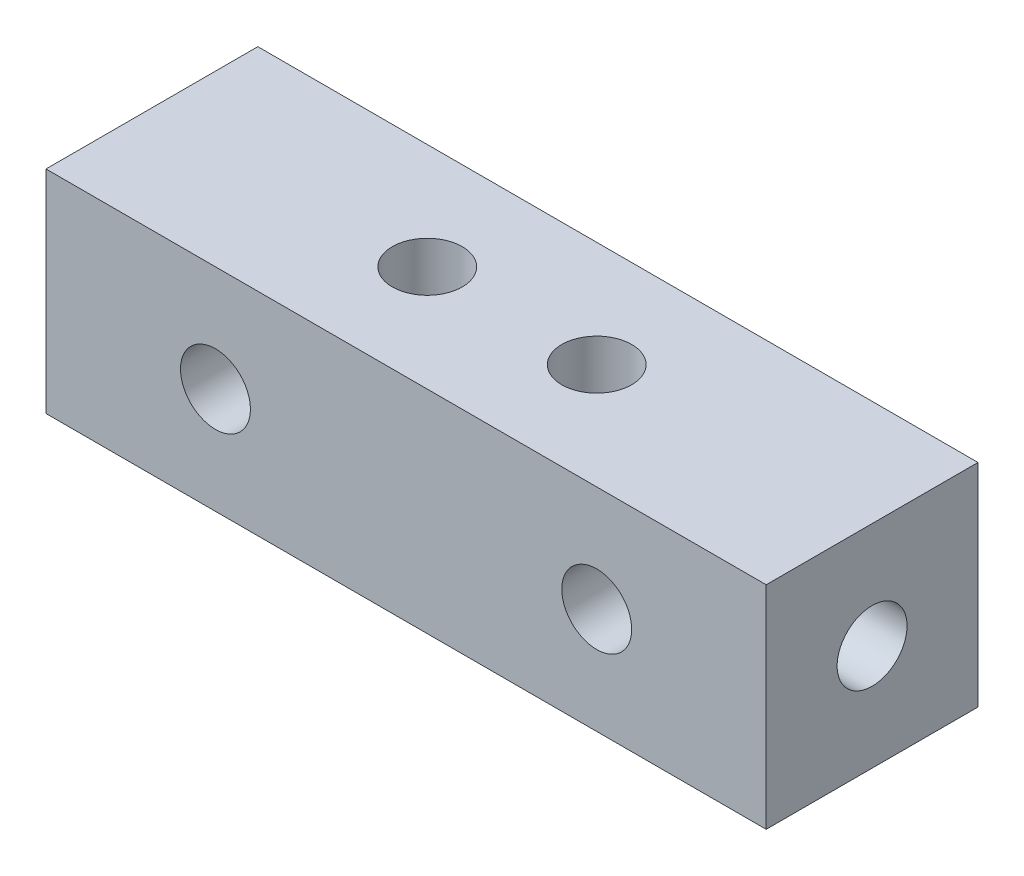
ISO-10303-21;
HEADER;
FILE_DESCRIPTION(('STEP AP214'),'2;1');
FILE_NAME('part.step','',(''),(''),'','','');
FILE_SCHEMA(('AUTOMOTIVE_DESIGN { 1 0 10303 214 1 1 1 1 }'));
ENDSEC;
DATA;
#1=APPLICATION_CONTEXT('core data for automotive mechanical design processes');
#2=APPLICATION_PROTOCOL_DEFINITION('international standard','automotive_design',2000,#1);
#3=PRODUCT_CONTEXT('',#1,'mechanical');
#4=PRODUCT('Part','Part','',(#3));
#5=PRODUCT_RELATED_PRODUCT_CATEGORY('part','',(#4));
#6=PRODUCT_DEFINITION_FORMATION('','',#4);
#7=PRODUCT_DEFINITION_CONTEXT('part definition',#1,'design');
#8=PRODUCT_DEFINITION('design','',#6,#7);
#9=PRODUCT_DEFINITION_SHAPE('','',#8);
#10=(LENGTH_UNIT() NAMED_UNIT(*) SI_UNIT(.MILLI.,.METRE.));
#11=(NAMED_UNIT(*) PLANE_ANGLE_UNIT() SI_UNIT($,.RADIAN.));
#12=(NAMED_UNIT(*) SI_UNIT($,.STERADIAN.) SOLID_ANGLE_UNIT());
#13=UNCERTAINTY_MEASURE_WITH_UNIT(LENGTH_MEASURE(1.E-05),#10,'distance_accuracy_value','');
#14=(GEOMETRIC_REPRESENTATION_CONTEXT(3) GLOBAL_UNCERTAINTY_ASSIGNED_CONTEXT((#13)) GLOBAL_UNIT_ASSIGNED_CONTEXT((#10,
#11,#12)) REPRESENTATION_CONTEXT('',''));
#15=CARTESIAN_POINT('',(0.,0.,0.));
#16=DIRECTION('',(0.,0.,1.));
#17=DIRECTION('',(1.,0.,0.));
#18=AXIS2_PLACEMENT_3D('',#15,#16,#17);
#19=CARTESIAN_POINT('',(17.,0.,5.));
#20=DIRECTION('',(1.,0.,0.));
#21=DIRECTION('',(0.,0.,-1.));
#22=AXIS2_PLACEMENT_3D('',#19,#20,#21);
#23=CYLINDRICAL_SURFACE('',#22,1.64999999999999);
#24=CARTESIAN_POINT('',(-4.,0.,5.));
#25=DIRECTION('',(0.707106781186547,-0.707106781186547,0.));
#26=DIRECTION('',(0.707106781186547,0.707106781186547,0.));
#27=AXIS2_PLACEMENT_3D('',#24,#25,#26);
#28=ELLIPSE('',#27,2.3334523779156,1.64999999999999);
#29=CARTESIAN_POINT('',(-4.,0.,6.64999999999999));
#30=VERTEX_POINT('',#29);
#31=CARTESIAN_POINT('',(-4.,0.,3.35000000000001));
#32=VERTEX_POINT('',#31);
#33=EDGE_CURVE('E143',#30,#32,#28,.T.);
#34=ORIENTED_EDGE('',*,*,#33,.T.);
#35=CARTESIAN_POINT('',(-4.,0.,5.));
#36=DIRECTION('',(0.707106781186547,0.707106781186547,0.));
#37=DIRECTION('',(0.707106781186547,-0.707106781186547,0.));
#38=AXIS2_PLACEMENT_3D('',#35,#36,#37);
#39=ELLIPSE('',#38,2.3334523779156,1.64999999999999);
#40=EDGE_CURVE('E139',#32,#30,#39,.T.);
#41=ORIENTED_EDGE('',*,*,#40,.T.);
#42=EDGE_LOOP('',(#34,#41));
#43=FACE_BOUND('',#42,.T.);
#44=CARTESIAN_POINT('',(-9.,0.,5.));
#45=DIRECTION('',(0.707106781186547,0.,0.707106781186547));
#46=DIRECTION('',(0.707106781186547,0.,-0.707106781186547));
#47=AXIS2_PLACEMENT_3D('',#44,#45,#46);
#48=ELLIPSE('',#47,2.3334523779156,1.64999999999999);
#49=CARTESIAN_POINT('',(-9.,1.64999999999999,5.));
#50=VERTEX_POINT('',#49);
#51=CARTESIAN_POINT('',(-9.,-1.64999999999999,5.));
#52=VERTEX_POINT('',#51);
#53=EDGE_CURVE('E55',#50,#52,#48,.F.);
#54=ORIENTED_EDGE('',*,*,#53,.T.);
#55=CARTESIAN_POINT('',(-9.,0.,5.));
#56=DIRECTION('',(0.707106781186547,0.,-0.707106781186547));
#57=DIRECTION('',(0.707106781186547,0.,0.707106781186547));
#58=AXIS2_PLACEMENT_3D('',#55,#56,#57);
#59=ELLIPSE('',#58,2.3334523779156,1.64999999999999);
#60=EDGE_CURVE('E11',#52,#50,#59,.F.);
#61=ORIENTED_EDGE('',*,*,#60,.T.);
#62=EDGE_LOOP('',(#54,#61));
#63=FACE_BOUND('',#62,.T.);
#64=ADVANCED_FACE('F41',(#43,#63),#23,.F.);
#65=CARTESIAN_POINT('',(17.,0.,5.));
#66=DIRECTION('',(1.,0.,0.));
#67=DIRECTION('',(0.,0.,-1.));
#68=AXIS2_PLACEMENT_3D('',#65,#66,#67);
#69=CIRCLE('',#68,1.64999999999999);
#70=CARTESIAN_POINT('',(17.,0.,3.35000000000001));
#71=VERTEX_POINT('',#70);
#72=EDGE_CURVE('E211',#71,#71,#69,.T.);
#73=ORIENTED_EDGE('',*,*,#72,.T.);
#74=EDGE_LOOP('',(#73));
#75=FACE_BOUND('',#74,.T.);
#76=CARTESIAN_POINT('',(9.,0.,5.));
#77=DIRECTION('',(0.707106781186547,0.,0.707106781186547));
#78=DIRECTION('',(0.707106781186547,0.,-0.707106781186547));
#79=AXIS2_PLACEMENT_3D('',#76,#77,#78);
#80=ELLIPSE('',#79,2.3334523779156,1.64999999999999);
#81=CARTESIAN_POINT('',(9.,1.64999999999999,5.));
#82=VERTEX_POINT('',#81);
#83=CARTESIAN_POINT('',(9.,-1.64999999999999,5.));
#84=VERTEX_POINT('',#83);
#85=EDGE_CURVE('E62',#82,#84,#80,.F.);
#86=ORIENTED_EDGE('',*,*,#85,.T.);
#87=CARTESIAN_POINT('',(9.,0.,5.));
#88=DIRECTION('',(0.707106781186547,0.,-0.707106781186547));
#89=DIRECTION('',(0.707106781186547,0.,0.707106781186547));
#90=AXIS2_PLACEMENT_3D('',#87,#88,#89);
#91=ELLIPSE('',#90,2.3334523779156,1.64999999999999);
#92=EDGE_CURVE('E117',#84,#82,#91,.F.);
#93=ORIENTED_EDGE('',*,*,#92,.T.);
#94=EDGE_LOOP('',(#86,#93));
#95=FACE_BOUND('',#94,.T.);
#96=ADVANCED_FACE('F285',(#75,#95),#23,.F.);
#97=CARTESIAN_POINT('',(4.,0.,5.));
#98=DIRECTION('',(0.707106781186547,-0.707106781186547,0.));
#99=DIRECTION('',(0.707106781186547,0.707106781186547,0.));
#100=AXIS2_PLACEMENT_3D('',#97,#98,#99);
#101=ELLIPSE('',#100,2.3334523779156,1.64999999999999);
#102=CARTESIAN_POINT('',(4.,0.,6.64999999999999));
#103=VERTEX_POINT('',#102);
#104=CARTESIAN_POINT('',(4.,0.,3.35000000000001));
#105=VERTEX_POINT('',#104);
#106=EDGE_CURVE('E158',#103,#105,#101,.T.);
#107=ORIENTED_EDGE('',*,*,#106,.T.);
#108=CARTESIAN_POINT('',(4.,0.,5.));
#109=DIRECTION('',(0.707106781186547,0.707106781186547,0.));
#110=DIRECTION('',(0.707106781186547,-0.707106781186547,0.));
#111=AXIS2_PLACEMENT_3D('',#108,#109,#110);
#112=ELLIPSE('',#111,2.3334523779156,1.64999999999999);
#113=EDGE_CURVE('E154',#105,#103,#112,.T.);
#114=ORIENTED_EDGE('',*,*,#113,.T.);
#115=EDGE_LOOP('',(#107,#114));
#116=FACE_BOUND('',#115,.T.);
#117=CARTESIAN_POINT('',(-4.,0.,5.));
#118=DIRECTION('',(0.707106781186547,-0.707106781186547,0.));
#119=DIRECTION('',(0.707106781186547,0.707106781186547,0.));
#120=AXIS2_PLACEMENT_3D('',#117,#118,#119);
#121=ELLIPSE('',#120,2.3334523779156,1.64999999999999);
#122=EDGE_CURVE('E147',#30,#32,#121,.F.);
#123=ORIENTED_EDGE('',*,*,#122,.T.);
#124=CARTESIAN_POINT('',(-4.,0.,5.));
#125=DIRECTION('',(0.707106781186547,0.707106781186547,0.));
#126=DIRECTION('',(0.707106781186547,-0.707106781186547,0.));
#127=AXIS2_PLACEMENT_3D('',#124,#125,#126);
#128=ELLIPSE('',#127,2.3334523779156,1.64999999999999);
#129=EDGE_CURVE('E135',#32,#30,#128,.F.);
#130=ORIENTED_EDGE('',*,*,#129,.T.);
#131=EDGE_LOOP('',(#123,#130));
#132=FACE_BOUND('',#131,.T.);
#133=ADVANCED_FACE('F290',(#116,#132),#23,.F.);
#134=CARTESIAN_POINT('',(9.,0.,5.));
#135=DIRECTION('',(0.707106781186547,0.,0.707106781186547));
#136=DIRECTION('',(0.707106781186547,0.,-0.707106781186547));
#137=AXIS2_PLACEMENT_3D('',#134,#135,#136);
#138=ELLIPSE('',#137,2.3334523779156,1.64999999999999);
#139=EDGE_CURVE('E129',#82,#84,#138,.T.);
#140=ORIENTED_EDGE('',*,*,#139,.T.);
#141=CARTESIAN_POINT('',(9.,0.,5.));
#142=DIRECTION('',(0.707106781186547,0.,-0.707106781186547));
#143=DIRECTION('',(0.707106781186547,0.,0.707106781186547));
#144=AXIS2_PLACEMENT_3D('',#141,#142,#143);
#145=ELLIPSE('',#144,2.3334523779156,1.64999999999999);
#146=EDGE_CURVE('E125',#84,#82,#145,.T.);
#147=ORIENTED_EDGE('',*,*,#146,.T.);
#148=EDGE_LOOP('',(#140,#147));
#149=FACE_BOUND('',#148,.T.);
#150=CARTESIAN_POINT('',(4.,0.,5.));
#151=DIRECTION('',(0.707106781186547,-0.707106781186547,0.));
#152=DIRECTION('',(0.707106781186547,0.707106781186547,0.));
#153=AXIS2_PLACEMENT_3D('',#150,#151,#152);
#154=ELLIPSE('',#153,2.3334523779156,1.64999999999999);
#155=EDGE_CURVE('E162',#103,#105,#154,.F.);
#156=ORIENTED_EDGE('',*,*,#155,.T.);
#157=CARTESIAN_POINT('',(4.,0.,5.));
#158=DIRECTION('',(0.707106781186547,0.707106781186547,0.));
#159=DIRECTION('',(0.707106781186547,-0.707106781186547,0.));
#160=AXIS2_PLACEMENT_3D('',#157,#158,#159);
#161=ELLIPSE('',#160,2.3334523779156,1.64999999999999);
#162=EDGE_CURVE('E150',#105,#103,#161,.F.);
#163=ORIENTED_EDGE('',*,*,#162,.T.);
#164=EDGE_LOOP('',(#156,#163));
#165=FACE_BOUND('',#164,.T.);
#166=ADVANCED_FACE('F295',(#149,#165),#23,.F.);
#167=CARTESIAN_POINT('',(-17.,-5.,10.));
#168=DIRECTION('',(1.,0.,0.));
#169=DIRECTION('',(0.,0.,-1.));
#170=AXIS2_PLACEMENT_3D('',#167,#168,#169);
#171=PLANE('',#170);
#172=CARTESIAN_POINT('',(-17.,0.,5.));
#173=DIRECTION('',(1.,0.,0.));
#174=DIRECTION('',(0.,0.,-1.));
#175=AXIS2_PLACEMENT_3D('',#172,#173,#174);
#176=CIRCLE('',#175,1.65);
#177=CARTESIAN_POINT('',(-17.,0.,3.35));
#178=VERTEX_POINT('',#177);
#179=EDGE_CURVE('E196',#178,#178,#176,.T.);
#180=ORIENTED_EDGE('',*,*,#179,.T.);
#181=EDGE_LOOP('',(#180));
#182=FACE_BOUND('',#181,.T.);
#183=DIRECTION('',(0.,-1.,0.));
#184=VECTOR('',#183,1.);
#185=CARTESIAN_POINT('',(-17.,-5.,0.));
#186=LINE('',#185,#184);
#187=CARTESIAN_POINT('',(-17.,5.,0.));
#188=VERTEX_POINT('',#187);
#189=CARTESIAN_POINT('',(-17.,-5.,0.));
#190=VERTEX_POINT('',#189);
#191=EDGE_CURVE('E192',#188,#190,#186,.T.);
#192=ORIENTED_EDGE('',*,*,#191,.T.);
#193=DIRECTION('',(0.,0.,-1.));
#194=VECTOR('',#193,1.);
#195=CARTESIAN_POINT('',(-17.,-5.,10.));
#196=LINE('',#195,#194);
#197=CARTESIAN_POINT('',(-17.,-5.,10.));
#198=VERTEX_POINT('',#197);
#199=EDGE_CURVE('E165',#198,#190,#196,.T.);
#200=ORIENTED_EDGE('',*,*,#199,.F.);
#201=DIRECTION('',(0.,-1.,0.));
#202=VECTOR('',#201,1.);
#203=CARTESIAN_POINT('',(-17.,-5.,10.));
#204=LINE('',#203,#202);
#205=CARTESIAN_POINT('',(-17.,5.,10.));
#206=VERTEX_POINT('',#205);
#207=EDGE_CURVE('E185',#206,#198,#204,.T.);
#208=ORIENTED_EDGE('',*,*,#207,.F.);
#209=DIRECTION('',(0.,0.,-1.));
#210=VECTOR('',#209,1.);
#211=CARTESIAN_POINT('',(-17.,5.,10.));
#212=LINE('',#211,#210);
#213=EDGE_CURVE('E177',#206,#188,#212,.T.);
#214=ORIENTED_EDGE('',*,*,#213,.T.);
#215=EDGE_LOOP('',(#192,#200,#208,#214));
#216=FACE_BOUND('',#215,.T.);
#217=ADVANCED_FACE('F43',(#182,#216),#171,.F.);
#218=CARTESIAN_POINT('',(17.,-5.,10.));
#219=DIRECTION('',(0.,1.,0.));
#220=DIRECTION('',(-1.,0.,0.));
#221=AXIS2_PLACEMENT_3D('',#218,#219,#220);
#222=PLANE('',#221);
#223=CARTESIAN_POINT('',(-4.,-5.00000000000001,5.));
#224=DIRECTION('',(0.,1.,0.));
#225=DIRECTION('',(0.,0.,1.));
#226=AXIS2_PLACEMENT_3D('',#223,#224,#225);
#227=CIRCLE('',#226,1.65);
#228=CARTESIAN_POINT('',(-4.,-5.00000000000001,6.65));
#229=VERTEX_POINT('',#228);
#230=EDGE_CURVE('E223',#229,#229,#227,.T.);
#231=ORIENTED_EDGE('',*,*,#230,.T.);
#232=EDGE_LOOP('',(#231));
#233=FACE_BOUND('',#232,.T.);
#234=CARTESIAN_POINT('',(4.,-5.,5.));
#235=DIRECTION('',(0.,1.,0.));
#236=DIRECTION('',(0.,0.,1.));
#237=AXIS2_PLACEMENT_3D('',#234,#235,#236);
#238=CIRCLE('',#237,1.65);
#239=CARTESIAN_POINT('',(4.,-5.,6.65));
#240=VERTEX_POINT('',#239);
#241=EDGE_CURVE('E215',#240,#240,#238,.T.);
#242=ORIENTED_EDGE('',*,*,#241,.T.);
#243=EDGE_LOOP('',(#242));
#244=FACE_BOUND('',#243,.T.);
#245=DIRECTION('',(1.,0.,0.));
#246=VECTOR('',#245,1.);
#247=CARTESIAN_POINT('',(17.,-5.,0.));
#248=LINE('',#247,#246);
#249=CARTESIAN_POINT('',(17.,-5.,0.));
#250=VERTEX_POINT('',#249);
#251=EDGE_CURVE('E189',#190,#250,#248,.T.);
#252=ORIENTED_EDGE('',*,*,#251,.T.);
#253=DIRECTION('',(0.,0.,-1.));
#254=VECTOR('',#253,1.);
#255=CARTESIAN_POINT('',(17.,-5.,10.));
#256=LINE('',#255,#254);
#257=CARTESIAN_POINT('',(17.,-5.,10.));
#258=VERTEX_POINT('',#257);
#259=EDGE_CURVE('E169',#258,#250,#256,.T.);
#260=ORIENTED_EDGE('',*,*,#259,.F.);
#261=DIRECTION('',(1.,0.,0.));
#262=VECTOR('',#261,1.);
#263=CARTESIAN_POINT('',(17.,-5.,10.));
#264=LINE('',#263,#262);
#265=EDGE_CURVE('E202',#198,#258,#264,.T.);
#266=ORIENTED_EDGE('',*,*,#265,.F.);
#267=ORIENTED_EDGE('',*,*,#199,.T.);
#268=EDGE_LOOP('',(#252,#260,#266,#267));
#269=FACE_BOUND('',#268,.T.);
#270=ADVANCED_FACE('F272',(#233,#244,#269),#222,.F.);
#271=CARTESIAN_POINT('',(17.,-5.,10.));
#272=DIRECTION('',(-1.,0.,0.));
#273=DIRECTION('',(0.,0.,1.));
#274=AXIS2_PLACEMENT_3D('',#271,#272,#273);
#275=PLANE('',#274);
#276=ORIENTED_EDGE('',*,*,#72,.F.);
#277=EDGE_LOOP('',(#276));
#278=FACE_BOUND('',#277,.T.);
#279=DIRECTION('',(0.,1.,0.));
#280=VECTOR('',#279,1.);
#281=CARTESIAN_POINT('',(17.,-5.,0.));
#282=LINE('',#281,#280);
#283=CARTESIAN_POINT('',(17.,5.,0.));
#284=VERTEX_POINT('',#283);
#285=EDGE_CURVE('E186',#250,#284,#282,.T.);
#286=ORIENTED_EDGE('',*,*,#285,.T.);
#287=DIRECTION('',(0.,0.,-1.));
#288=VECTOR('',#287,1.);
#289=CARTESIAN_POINT('',(17.,5.,10.));
#290=LINE('',#289,#288);
#291=CARTESIAN_POINT('',(17.,5.,10.));
#292=VERTEX_POINT('',#291);
#293=EDGE_CURVE('E173',#292,#284,#290,.T.);
#294=ORIENTED_EDGE('',*,*,#293,.F.);
#295=DIRECTION('',(0.,1.,0.));
#296=VECTOR('',#295,1.);
#297=CARTESIAN_POINT('',(17.,-5.,10.));
#298=LINE('',#297,#296);
#299=EDGE_CURVE('E199',#258,#292,#298,.T.);
#300=ORIENTED_EDGE('',*,*,#299,.F.);
#301=ORIENTED_EDGE('',*,*,#259,.T.);
#302=EDGE_LOOP('',(#286,#294,#300,#301));
#303=FACE_BOUND('',#302,.T.);
#304=ADVANCED_FACE('F269',(#278,#303),#275,.F.);
#305=CARTESIAN_POINT('',(17.,5.,10.));
#306=DIRECTION('',(0.,-1.,0.));
#307=DIRECTION('',(1.,0.,0.));
#308=AXIS2_PLACEMENT_3D('',#305,#306,#307);
#309=PLANE('',#308);
#310=CARTESIAN_POINT('',(-4.,5.,5.));
#311=DIRECTION('',(0.,1.,0.));
#312=DIRECTION('',(0.,0.,1.));
#313=AXIS2_PLACEMENT_3D('',#310,#311,#312);
#314=CIRCLE('',#313,1.64999999999999);
#315=CARTESIAN_POINT('',(-4.,5.,6.64999999999999));
#316=VERTEX_POINT('',#315);
#317=EDGE_CURVE('E227',#316,#316,#314,.T.);
#318=ORIENTED_EDGE('',*,*,#317,.F.);
#319=EDGE_LOOP('',(#318));
#320=FACE_BOUND('',#319,.T.);
#321=CARTESIAN_POINT('',(4.,5.,5.));
#322=DIRECTION('',(0.,1.,0.));
#323=DIRECTION('',(0.,0.,1.));
#324=AXIS2_PLACEMENT_3D('',#321,#322,#323);
#325=CIRCLE('',#324,1.64999999999999);
#326=CARTESIAN_POINT('',(4.,5.,6.64999999999999));
#327=VERTEX_POINT('',#326);
#328=EDGE_CURVE('E219',#327,#327,#325,.T.);
#329=ORIENTED_EDGE('',*,*,#328,.F.);
#330=EDGE_LOOP('',(#329));
#331=FACE_BOUND('',#330,.T.);
#332=DIRECTION('',(-1.,0.,0.));
#333=VECTOR('',#332,1.);
#334=CARTESIAN_POINT('',(17.,5.,0.));
#335=LINE('',#334,#333);
#336=EDGE_CURVE('E182',#284,#188,#335,.T.);
#337=ORIENTED_EDGE('',*,*,#336,.T.);
#338=ORIENTED_EDGE('',*,*,#213,.F.);
#339=DIRECTION('',(-1.,0.,0.));
#340=VECTOR('',#339,1.);
#341=CARTESIAN_POINT('',(17.,5.,10.));
#342=LINE('',#341,#340);
#343=EDGE_CURVE('E181',#292,#206,#342,.T.);
#344=ORIENTED_EDGE('',*,*,#343,.F.);
#345=ORIENTED_EDGE('',*,*,#293,.T.);
#346=EDGE_LOOP('',(#337,#338,#344,#345));
#347=FACE_BOUND('',#346,.T.);
#348=ADVANCED_FACE('F265',(#320,#331,#347),#309,.F.);
#349=CARTESIAN_POINT('',(0.,0.,10.));
#350=DIRECTION('',(0.,0.,1.));
#351=DIRECTION('',(1.,0.,0.));
#352=AXIS2_PLACEMENT_3D('',#349,#350,#351);
#353=PLANE('',#352);
#354=CARTESIAN_POINT('',(-9.,0.,10.));
#355=DIRECTION('',(0.,0.,-1.));
#356=DIRECTION('',(-1.,0.,0.));
#357=AXIS2_PLACEMENT_3D('',#354,#355,#356);
#358=CIRCLE('',#357,1.65);
#359=CARTESIAN_POINT('',(-10.65,0.,10.));
#360=VERTEX_POINT('',#359);
#361=EDGE_CURVE('E239',#360,#360,#358,.T.);
#362=ORIENTED_EDGE('',*,*,#361,.T.);
#363=EDGE_LOOP('',(#362));
#364=FACE_BOUND('',#363,.T.);
#365=CARTESIAN_POINT('',(9.,0.,10.));
#366=DIRECTION('',(0.,0.,-1.));
#367=DIRECTION('',(-1.,0.,0.));
#368=AXIS2_PLACEMENT_3D('',#365,#366,#367);
#369=CIRCLE('',#368,1.65);
#370=CARTESIAN_POINT('',(7.35,0.,10.));
#371=VERTEX_POINT('',#370);
#372=EDGE_CURVE('E231',#371,#371,#369,.T.);
#373=ORIENTED_EDGE('',*,*,#372,.T.);
#374=EDGE_LOOP('',(#373));
#375=FACE_BOUND('',#374,.T.);
#376=ORIENTED_EDGE('',*,*,#207,.T.);
#377=ORIENTED_EDGE('',*,*,#265,.T.);
#378=ORIENTED_EDGE('',*,*,#299,.T.);
#379=ORIENTED_EDGE('',*,*,#343,.T.);
#380=EDGE_LOOP('',(#376,#377,#378,#379));
#381=FACE_BOUND('',#380,.T.);
#382=ADVANCED_FACE('F252',(#364,#375,#381),#353,.T.);
#383=CARTESIAN_POINT('',(0.,0.,0.));
#384=DIRECTION('',(0.,0.,1.));
#385=DIRECTION('',(1.,0.,0.));
#386=AXIS2_PLACEMENT_3D('',#383,#384,#385);
#387=PLANE('',#386);
#388=CARTESIAN_POINT('',(-9.,0.,0.));
#389=DIRECTION('',(0.,0.,-1.));
#390=DIRECTION('',(-1.,0.,0.));
#391=AXIS2_PLACEMENT_3D('',#388,#389,#390);
#392=CIRCLE('',#391,1.64999999999999);
#393=CARTESIAN_POINT('',(-10.65,0.,0.));
#394=VERTEX_POINT('',#393);
#395=EDGE_CURVE('E243',#394,#394,#392,.T.);
#396=ORIENTED_EDGE('',*,*,#395,.F.);
#397=EDGE_LOOP('',(#396));
#398=FACE_BOUND('',#397,.T.);
#399=CARTESIAN_POINT('',(9.,0.,0.));
#400=DIRECTION('',(0.,0.,-1.));
#401=DIRECTION('',(-1.,0.,0.));
#402=AXIS2_PLACEMENT_3D('',#399,#400,#401);
#403=CIRCLE('',#402,1.64999999999999);
#404=CARTESIAN_POINT('',(7.35000000000001,0.,0.));
#405=VERTEX_POINT('',#404);
#406=EDGE_CURVE('E235',#405,#405,#403,.T.);
#407=ORIENTED_EDGE('',*,*,#406,.F.);
#408=EDGE_LOOP('',(#407));
#409=FACE_BOUND('',#408,.T.);
#410=ORIENTED_EDGE('',*,*,#191,.F.);
#411=ORIENTED_EDGE('',*,*,#336,.F.);
#412=ORIENTED_EDGE('',*,*,#285,.F.);
#413=ORIENTED_EDGE('',*,*,#251,.F.);
#414=EDGE_LOOP('',(#410,#411,#412,#413));
#415=FACE_BOUND('',#414,.T.);
#416=ADVANCED_FACE('F249',(#398,#409,#415),#387,.F.);
#417=CARTESIAN_POINT('',(-9.,0.,5.));
#418=DIRECTION('',(0.707106781186547,0.,0.707106781186547));
#419=DIRECTION('',(0.707106781186547,0.,-0.707106781186547));
#420=AXIS2_PLACEMENT_3D('',#417,#418,#419);
#421=ELLIPSE('',#420,2.3334523779156,1.64999999999999);
#422=EDGE_CURVE('E108',#50,#52,#421,.T.);
#423=ORIENTED_EDGE('',*,*,#422,.T.);
#424=CARTESIAN_POINT('',(-9.,0.,5.));
#425=DIRECTION('',(0.707106781186547,0.,-0.707106781186547));
#426=DIRECTION('',(0.707106781186547,0.,0.707106781186547));
#427=AXIS2_PLACEMENT_3D('',#424,#425,#426);
#428=ELLIPSE('',#427,2.3334523779156,1.64999999999999);
#429=EDGE_CURVE('E50',#52,#50,#428,.T.);
#430=ORIENTED_EDGE('',*,*,#429,.T.);
#431=EDGE_LOOP('',(#423,#430));
#432=FACE_BOUND('',#431,.T.);
#433=ORIENTED_EDGE('',*,*,#179,.F.);
#434=EDGE_LOOP('',(#433));
#435=FACE_BOUND('',#434,.T.);
#436=ADVANCED_FACE('F119',(#432,#435),#23,.F.);
#437=CARTESIAN_POINT('',(4.,5.,5.));
#438=DIRECTION('',(0.,1.,0.));
#439=DIRECTION('',(0.,0.,1.));
#440=AXIS2_PLACEMENT_3D('',#437,#438,#439);
#441=CYLINDRICAL_SURFACE('',#440,1.64999999999999);
#442=ORIENTED_EDGE('',*,*,#328,.T.);
#443=EDGE_LOOP('',(#442));
#444=FACE_BOUND('',#443,.T.);
#445=ORIENTED_EDGE('',*,*,#155,.F.);
#446=ORIENTED_EDGE('',*,*,#113,.F.);
#447=EDGE_LOOP('',(#445,#446));
#448=FACE_BOUND('',#447,.T.);
#449=ADVANCED_FACE('F294',(#444,#448),#441,.F.);
#450=ORIENTED_EDGE('',*,*,#241,.F.);
#451=EDGE_LOOP('',(#450));
#452=FACE_BOUND('',#451,.T.);
#453=ORIENTED_EDGE('',*,*,#106,.F.);
#454=ORIENTED_EDGE('',*,*,#162,.F.);
#455=EDGE_LOOP('',(#453,#454));
#456=FACE_BOUND('',#455,.T.);
#457=ADVANCED_FACE('F299',(#452,#456),#441,.F.);
#458=CARTESIAN_POINT('',(-4.,5.,5.));
#459=DIRECTION('',(0.,1.,0.));
#460=DIRECTION('',(0.,0.,1.));
#461=AXIS2_PLACEMENT_3D('',#458,#459,#460);
#462=CYLINDRICAL_SURFACE('',#461,1.64999999999999);
#463=ORIENTED_EDGE('',*,*,#317,.T.);
#464=EDGE_LOOP('',(#463));
#465=FACE_BOUND('',#464,.T.);
#466=ORIENTED_EDGE('',*,*,#122,.F.);
#467=ORIENTED_EDGE('',*,*,#40,.F.);
#468=EDGE_LOOP('',(#466,#467));
#469=FACE_BOUND('',#468,.T.);
#470=ADVANCED_FACE('F320',(#465,#469),#462,.F.);
#471=ORIENTED_EDGE('',*,*,#230,.F.);
#472=EDGE_LOOP('',(#471));
#473=FACE_BOUND('',#472,.T.);
#474=ORIENTED_EDGE('',*,*,#33,.F.);
#475=ORIENTED_EDGE('',*,*,#129,.F.);
#476=EDGE_LOOP('',(#474,#475));
#477=FACE_BOUND('',#476,.T.);
#478=ADVANCED_FACE('F322',(#473,#477),#462,.F.);
#479=CARTESIAN_POINT('',(9.,0.,0.));
#480=DIRECTION('',(0.,0.,-1.));
#481=DIRECTION('',(-1.,0.,0.));
#482=AXIS2_PLACEMENT_3D('',#479,#480,#481);
#483=CYLINDRICAL_SURFACE('',#482,1.64999999999999);
#484=ORIENTED_EDGE('',*,*,#406,.T.);
#485=EDGE_LOOP('',(#484));
#486=FACE_BOUND('',#485,.T.);
#487=ORIENTED_EDGE('',*,*,#85,.F.);
#488=ORIENTED_EDGE('',*,*,#146,.F.);
#489=EDGE_LOOP('',(#487,#488));
#490=FACE_BOUND('',#489,.T.);
#491=ADVANCED_FACE('F324',(#486,#490),#483,.F.);
#492=ORIENTED_EDGE('',*,*,#372,.F.);
#493=EDGE_LOOP('',(#492));
#494=FACE_BOUND('',#493,.T.);
#495=ORIENTED_EDGE('',*,*,#139,.F.);
#496=ORIENTED_EDGE('',*,*,#92,.F.);
#497=EDGE_LOOP('',(#495,#496));
#498=FACE_BOUND('',#497,.T.);
#499=ADVANCED_FACE('F331',(#494,#498),#483,.F.);
#500=CARTESIAN_POINT('',(-9.,0.,0.));
#501=DIRECTION('',(0.,0.,-1.));
#502=DIRECTION('',(-1.,0.,0.));
#503=AXIS2_PLACEMENT_3D('',#500,#501,#502);
#504=CYLINDRICAL_SURFACE('',#503,1.64999999999999);
#505=ORIENTED_EDGE('',*,*,#395,.T.);
#506=EDGE_LOOP('',(#505));
#507=FACE_BOUND('',#506,.T.);
#508=ORIENTED_EDGE('',*,*,#53,.F.);
#509=ORIENTED_EDGE('',*,*,#429,.F.);
#510=EDGE_LOOP('',(#508,#509));
#511=FACE_BOUND('',#510,.T.);
#512=ADVANCED_FACE('F115',(#507,#511),#504,.F.);
#513=ORIENTED_EDGE('',*,*,#361,.F.);
#514=EDGE_LOOP('',(#513));
#515=FACE_BOUND('',#514,.T.);
#516=ORIENTED_EDGE('',*,*,#422,.F.);
#517=ORIENTED_EDGE('',*,*,#60,.F.);
#518=EDGE_LOOP('',(#516,#517));
#519=FACE_BOUND('',#518,.T.);
#520=ADVANCED_FACE('F109',(#515,#519),#504,.F.);
#521=CLOSED_SHELL('',(#64,#96,#133,#166,#217,#270,#304,#348,#382,#416,#436,#449,#457,#470,#478,
#491,#499,#512,#520));
#522=MANIFOLD_SOLID_BREP('B2',#521);
#523=ADVANCED_BREP_SHAPE_REPRESENTATION('',(#18,#522),#14);
#524=SHAPE_DEFINITION_REPRESENTATION(#9,#523);
ENDSEC;
END-ISO-10303-21;
